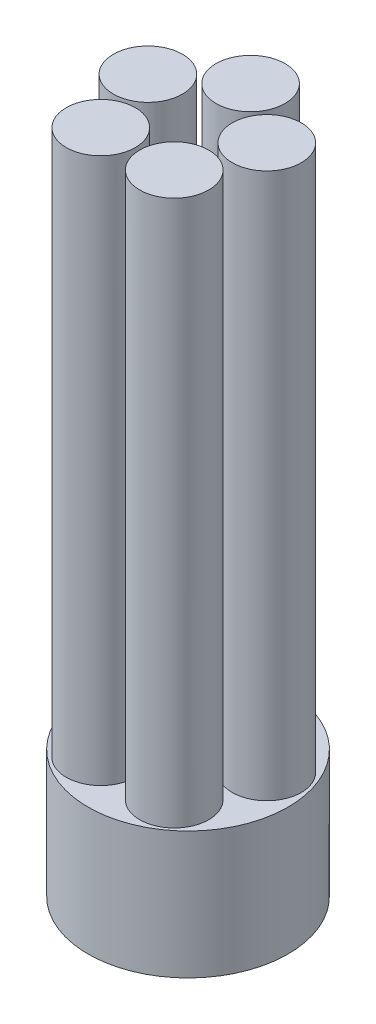
ISO-10303-21;
HEADER;
FILE_DESCRIPTION(('STEP AP214'),'2;1');
FILE_NAME('part.step','',(''),(''),'','','');
FILE_SCHEMA(('AUTOMOTIVE_DESIGN { 1 0 10303 214 1 1 1 1 }'));
ENDSEC;
DATA;
#1=APPLICATION_CONTEXT('core data for automotive mechanical design processes');
#2=APPLICATION_PROTOCOL_DEFINITION('international standard','automotive_design',2000,#1);
#3=PRODUCT_CONTEXT('',#1,'mechanical');
#4=PRODUCT('Part','Part','',(#3));
#5=PRODUCT_RELATED_PRODUCT_CATEGORY('part','',(#4));
#6=PRODUCT_DEFINITION_FORMATION('','',#4);
#7=PRODUCT_DEFINITION_CONTEXT('part definition',#1,'design');
#8=PRODUCT_DEFINITION('design','',#6,#7);
#9=PRODUCT_DEFINITION_SHAPE('','',#8);
#10=(LENGTH_UNIT() NAMED_UNIT(*) SI_UNIT(.MILLI.,.METRE.));
#11=(NAMED_UNIT(*) PLANE_ANGLE_UNIT() SI_UNIT($,.RADIAN.));
#12=(NAMED_UNIT(*) SI_UNIT($,.STERADIAN.) SOLID_ANGLE_UNIT());
#13=UNCERTAINTY_MEASURE_WITH_UNIT(LENGTH_MEASURE(1.E-05),#10,'distance_accuracy_value','');
#14=(GEOMETRIC_REPRESENTATION_CONTEXT(3) GLOBAL_UNCERTAINTY_ASSIGNED_CONTEXT((#13)) GLOBAL_UNIT_ASSIGNED_CONTEXT((#10,
#11,#12)) REPRESENTATION_CONTEXT('',''));
#15=CARTESIAN_POINT('',(0.,0.,0.));
#16=DIRECTION('',(0.,0.,1.));
#17=DIRECTION('',(1.,0.,0.));
#18=AXIS2_PLACEMENT_3D('',#15,#16,#17);
#19=CARTESIAN_POINT('',(65.3702325517877,600.,-21.2400761034011));
#20=DIRECTION('',(0.,-1.,0.));
#21=DIRECTION('',(0.,0.,-1.));
#22=AXIS2_PLACEMENT_3D('',#19,#20,#21);
#23=CYLINDRICAL_SURFACE('',#22,38.);
#24=CARTESIAN_POINT('',(65.3702325517877,600.,-21.2400761034011));
#25=DIRECTION('',(0.,1.,0.));
#26=DIRECTION('',(0.,0.,1.));
#27=AXIS2_PLACEMENT_3D('',#24,#25,#26);
#28=CIRCLE('',#27,38.);
#29=CARTESIAN_POINT('',(65.3702325517877,600.,16.7599238965989));
#30=VERTEX_POINT('',#29);
#31=EDGE_CURVE('E68',#30,#30,#28,.T.);
#32=ORIENTED_EDGE('',*,*,#31,.F.);
#33=EDGE_LOOP('',(#32));
#34=FACE_BOUND('',#33,.T.);
#35=CARTESIAN_POINT('',(65.3702325517877,0.,-21.2400761034011));
#36=DIRECTION('',(0.,1.,0.));
#37=DIRECTION('',(0.,0.,1.));
#38=AXIS2_PLACEMENT_3D('',#35,#36,#37);
#39=CIRCLE('',#38,38.);
#40=CARTESIAN_POINT('',(65.3702325517877,0.,16.7599238965989));
#41=VERTEX_POINT('',#40);
#42=EDGE_CURVE('E69',#41,#41,#39,.T.);
#43=ORIENTED_EDGE('',*,*,#42,.T.);
#44=EDGE_LOOP('',(#43));
#45=FACE_BOUND('',#44,.T.);
#46=ADVANCED_FACE('F49',(#34,#45),#23,.T.);
#47=CARTESIAN_POINT('',(0.,600.,0.));
#48=DIRECTION('',(0.,1.,0.));
#49=DIRECTION('',(0.,0.,1.));
#50=AXIS2_PLACEMENT_3D('',#47,#48,#49);
#51=PLANE('',#50);
#52=ORIENTED_EDGE('',*,*,#31,.T.);
#53=EDGE_LOOP('',(#52));
#54=FACE_BOUND('',#53,.T.);
#55=ADVANCED_FACE('F108',(#54),#51,.T.);
#56=CARTESIAN_POINT('',(0.,-140.,0.));
#57=DIRECTION('',(0.,1.,0.));
#58=DIRECTION('',(0.,0.,1.));
#59=AXIS2_PLACEMENT_3D('',#56,#57,#58);
#60=CYLINDRICAL_SURFACE('',#59,110.);
#61=CARTESIAN_POINT('',(0.,-140.,0.));
#62=DIRECTION('',(0.,-1.,0.));
#63=DIRECTION('',(0.,0.,-1.));
#64=AXIS2_PLACEMENT_3D('',#61,#62,#63);
#65=CIRCLE('',#64,110.);
#66=CARTESIAN_POINT('',(0.,-140.,-110.));
#67=VERTEX_POINT('',#66);
#68=EDGE_CURVE('E72',#67,#67,#65,.T.);
#69=ORIENTED_EDGE('',*,*,#68,.F.);
#70=EDGE_LOOP('',(#69));
#71=FACE_BOUND('',#70,.T.);
#72=CARTESIAN_POINT('',(0.,0.,0.));
#73=DIRECTION('',(0.,-1.,0.));
#74=DIRECTION('',(0.,0.,-1.));
#75=AXIS2_PLACEMENT_3D('',#72,#73,#74);
#76=CIRCLE('',#75,110.);
#77=CARTESIAN_POINT('',(0.,0.,-110.));
#78=VERTEX_POINT('',#77);
#79=EDGE_CURVE('E75',#78,#78,#76,.T.);
#80=ORIENTED_EDGE('',*,*,#79,.T.);
#81=EDGE_LOOP('',(#80));
#82=FACE_BOUND('',#81,.T.);
#83=ADVANCED_FACE('F113',(#71,#82),#60,.T.);
#84=CARTESIAN_POINT('',(0.,-140.,0.));
#85=DIRECTION('',(0.,-1.,0.));
#86=DIRECTION('',(0.,0.,-1.));
#87=AXIS2_PLACEMENT_3D('',#84,#85,#86);
#88=PLANE('',#87);
#89=ORIENTED_EDGE('',*,*,#68,.T.);
#90=EDGE_LOOP('',(#89));
#91=FACE_BOUND('',#90,.T.);
#92=ADVANCED_FACE('F123',(#91),#88,.T.);
#93=CARTESIAN_POINT('',(0.,0.,0.));
#94=DIRECTION('',(0.,-1.,0.));
#95=DIRECTION('',(0.,0.,-1.));
#96=AXIS2_PLACEMENT_3D('',#93,#94,#95);
#97=PLANE('',#96);
#98=CARTESIAN_POINT('',(0.,0.,-68.7343301178754));
#99=DIRECTION('',(0.,-1.,0.));
#100=DIRECTION('',(0.,0.,-1.));
#101=AXIS2_PLACEMENT_3D('',#98,#99,#100);
#102=CIRCLE('',#101,38.);
#103=CARTESIAN_POINT('',(0.,0.,-106.734330117875));
#104=VERTEX_POINT('',#103);
#105=EDGE_CURVE('E11',#104,#104,#102,.F.);
#106=ORIENTED_EDGE('',*,*,#105,.F.);
#107=EDGE_LOOP('',(#106));
#108=FACE_BOUND('',#107,.T.);
#109=CARTESIAN_POINT('',(-65.3702325517874,0.,-21.240076103402));
#110=DIRECTION('',(0.,-1.,0.));
#111=DIRECTION('',(0.,0.,-1.));
#112=AXIS2_PLACEMENT_3D('',#109,#110,#111);
#113=CIRCLE('',#112,38.);
#114=CARTESIAN_POINT('',(-65.3702325517874,0.,-59.240076103402));
#115=VERTEX_POINT('',#114);
#116=EDGE_CURVE('E55',#115,#115,#113,.F.);
#117=ORIENTED_EDGE('',*,*,#116,.F.);
#118=EDGE_LOOP('',(#117));
#119=FACE_BOUND('',#118,.T.);
#120=CARTESIAN_POINT('',(-40.40102556949,0.,55.6072411623386));
#121=DIRECTION('',(0.,-1.,0.));
#122=DIRECTION('',(0.,0.,-1.));
#123=AXIS2_PLACEMENT_3D('',#120,#121,#122);
#124=CIRCLE('',#123,38.);
#125=CARTESIAN_POINT('',(-40.40102556949,0.,17.6072411623386));
#126=VERTEX_POINT('',#125);
#127=EDGE_CURVE('E59',#126,#126,#124,.F.);
#128=ORIENTED_EDGE('',*,*,#127,.F.);
#129=EDGE_LOOP('',(#128));
#130=FACE_BOUND('',#129,.T.);
#131=CARTESIAN_POINT('',(40.4010255694892,0.,55.6072411623392));
#132=DIRECTION('',(0.,-1.,0.));
#133=DIRECTION('',(0.,0.,-1.));
#134=AXIS2_PLACEMENT_3D('',#131,#132,#133);
#135=CIRCLE('',#134,38.);
#136=CARTESIAN_POINT('',(40.4010255694892,0.,17.6072411623392));
#137=VERTEX_POINT('',#136);
#138=EDGE_CURVE('E63',#137,#137,#135,.F.);
#139=ORIENTED_EDGE('',*,*,#138,.F.);
#140=EDGE_LOOP('',(#139));
#141=FACE_BOUND('',#140,.T.);
#142=ORIENTED_EDGE('',*,*,#42,.F.);
#143=EDGE_LOOP('',(#142));
#144=FACE_BOUND('',#143,.T.);
#145=ORIENTED_EDGE('',*,*,#79,.F.);
#146=EDGE_LOOP('',(#145));
#147=FACE_BOUND('',#146,.T.);
#148=ADVANCED_FACE('F119',(#108,#119,#130,#141,#144,#147),#97,.F.);
#149=CARTESIAN_POINT('',(40.4010255694892,600.,55.6072411623392));
#150=DIRECTION('',(0.,-1.,0.));
#151=DIRECTION('',(0.,0.,-1.));
#152=AXIS2_PLACEMENT_3D('',#149,#150,#151);
#153=CYLINDRICAL_SURFACE('',#152,38.);
#154=CARTESIAN_POINT('',(40.4010255694892,600.,55.6072411623392));
#155=DIRECTION('',(0.,1.,0.));
#156=DIRECTION('',(0.,0.,1.));
#157=AXIS2_PLACEMENT_3D('',#154,#155,#156);
#158=CIRCLE('',#157,38.);
#159=CARTESIAN_POINT('',(40.4010255694892,600.,93.6072411623392));
#160=VERTEX_POINT('',#159);
#161=EDGE_CURVE('E78',#160,#160,#158,.T.);
#162=ORIENTED_EDGE('',*,*,#161,.F.);
#163=EDGE_LOOP('',(#162));
#164=FACE_BOUND('',#163,.T.);
#165=ORIENTED_EDGE('',*,*,#138,.T.);
#166=EDGE_LOOP('',(#165));
#167=FACE_BOUND('',#166,.T.);
#168=ADVANCED_FACE('F122',(#164,#167),#153,.T.);
#169=CARTESIAN_POINT('',(0.,600.,0.));
#170=DIRECTION('',(0.,1.,0.));
#171=DIRECTION('',(0.,0.,1.));
#172=AXIS2_PLACEMENT_3D('',#169,#170,#171);
#173=PLANE('',#172);
#174=ORIENTED_EDGE('',*,*,#161,.T.);
#175=EDGE_LOOP('',(#174));
#176=FACE_BOUND('',#175,.T.);
#177=ADVANCED_FACE('F138',(#176),#173,.T.);
#178=CARTESIAN_POINT('',(-40.40102556949,600.,55.6072411623386));
#179=DIRECTION('',(0.,-1.,0.));
#180=DIRECTION('',(0.,0.,-1.));
#181=AXIS2_PLACEMENT_3D('',#178,#179,#180);
#182=CYLINDRICAL_SURFACE('',#181,38.);
#183=CARTESIAN_POINT('',(-40.40102556949,600.,55.6072411623386));
#184=DIRECTION('',(0.,1.,0.));
#185=DIRECTION('',(0.,0.,1.));
#186=AXIS2_PLACEMENT_3D('',#183,#184,#185);
#187=CIRCLE('',#186,38.);
#188=CARTESIAN_POINT('',(-40.40102556949,600.,93.6072411623386));
#189=VERTEX_POINT('',#188);
#190=EDGE_CURVE('E83',#189,#189,#187,.T.);
#191=ORIENTED_EDGE('',*,*,#190,.F.);
#192=EDGE_LOOP('',(#191));
#193=FACE_BOUND('',#192,.T.);
#194=ORIENTED_EDGE('',*,*,#127,.T.);
#195=EDGE_LOOP('',(#194));
#196=FACE_BOUND('',#195,.T.);
#197=ADVANCED_FACE('F141',(#193,#196),#182,.T.);
#198=CARTESIAN_POINT('',(0.,600.,0.));
#199=DIRECTION('',(0.,1.,0.));
#200=DIRECTION('',(0.,0.,1.));
#201=AXIS2_PLACEMENT_3D('',#198,#199,#200);
#202=PLANE('',#201);
#203=ORIENTED_EDGE('',*,*,#190,.T.);
#204=EDGE_LOOP('',(#203));
#205=FACE_BOUND('',#204,.T.);
#206=ADVANCED_FACE('F146',(#205),#202,.T.);
#207=CARTESIAN_POINT('',(-65.3702325517874,600.,-21.240076103402));
#208=DIRECTION('',(0.,-1.,0.));
#209=DIRECTION('',(0.,0.,-1.));
#210=AXIS2_PLACEMENT_3D('',#207,#208,#209);
#211=CYLINDRICAL_SURFACE('',#210,38.);
#212=CARTESIAN_POINT('',(-65.3702325517874,600.,-21.240076103402));
#213=DIRECTION('',(0.,1.,0.));
#214=DIRECTION('',(0.,0.,1.));
#215=AXIS2_PLACEMENT_3D('',#212,#213,#214);
#216=CIRCLE('',#215,38.);
#217=CARTESIAN_POINT('',(-65.3702325517874,600.,16.759923896598));
#218=VERTEX_POINT('',#217);
#219=EDGE_CURVE('E86',#218,#218,#216,.T.);
#220=ORIENTED_EDGE('',*,*,#219,.F.);
#221=EDGE_LOOP('',(#220));
#222=FACE_BOUND('',#221,.T.);
#223=ORIENTED_EDGE('',*,*,#116,.T.);
#224=EDGE_LOOP('',(#223));
#225=FACE_BOUND('',#224,.T.);
#226=ADVANCED_FACE('F104',(#222,#225),#211,.T.);
#227=CARTESIAN_POINT('',(0.,600.,0.));
#228=DIRECTION('',(0.,1.,0.));
#229=DIRECTION('',(0.,0.,1.));
#230=AXIS2_PLACEMENT_3D('',#227,#228,#229);
#231=PLANE('',#230);
#232=ORIENTED_EDGE('',*,*,#219,.T.);
#233=EDGE_LOOP('',(#232));
#234=FACE_BOUND('',#233,.T.);
#235=ADVANCED_FACE('F97',(#234),#231,.T.);
#236=CARTESIAN_POINT('',(0.,600.,-68.7343301178754));
#237=DIRECTION('',(0.,-1.,0.));
#238=DIRECTION('',(0.,0.,-1.));
#239=AXIS2_PLACEMENT_3D('',#236,#237,#238);
#240=CYLINDRICAL_SURFACE('',#239,38.);
#241=CARTESIAN_POINT('',(0.,600.,-68.7343301178754));
#242=DIRECTION('',(0.,1.,0.));
#243=DIRECTION('',(0.,0.,1.));
#244=AXIS2_PLACEMENT_3D('',#241,#242,#243);
#245=CIRCLE('',#244,38.);
#246=CARTESIAN_POINT('',(0.,600.,-30.7343301178754));
#247=VERTEX_POINT('',#246);
#248=EDGE_CURVE('E89',#247,#247,#245,.T.);
#249=ORIENTED_EDGE('',*,*,#248,.F.);
#250=EDGE_LOOP('',(#249));
#251=FACE_BOUND('',#250,.T.);
#252=ORIENTED_EDGE('',*,*,#105,.T.);
#253=EDGE_LOOP('',(#252));
#254=FACE_BOUND('',#253,.T.);
#255=ADVANCED_FACE('F95',(#251,#254),#240,.T.);
#256=CARTESIAN_POINT('',(0.,600.,-68.7343301178754));
#257=DIRECTION('',(0.,1.,0.));
#258=DIRECTION('',(0.,0.,1.));
#259=AXIS2_PLACEMENT_3D('',#256,#257,#258);
#260=PLANE('',#259);
#261=ORIENTED_EDGE('',*,*,#248,.T.);
#262=EDGE_LOOP('',(#261));
#263=FACE_BOUND('',#262,.T.);
#264=ADVANCED_FACE('F93',(#263),#260,.T.);
#265=CLOSED_SHELL('',(#46,#55,#83,#92,#148,#168,#177,#197,#206,#226,#235,#255,#264));
#266=MANIFOLD_SOLID_BREP('B2',#265);
#267=ADVANCED_BREP_SHAPE_REPRESENTATION('',(#18,#266),#14);
#268=SHAPE_DEFINITION_REPRESENTATION(#9,#267);
ENDSEC;
END-ISO-10303-21;
